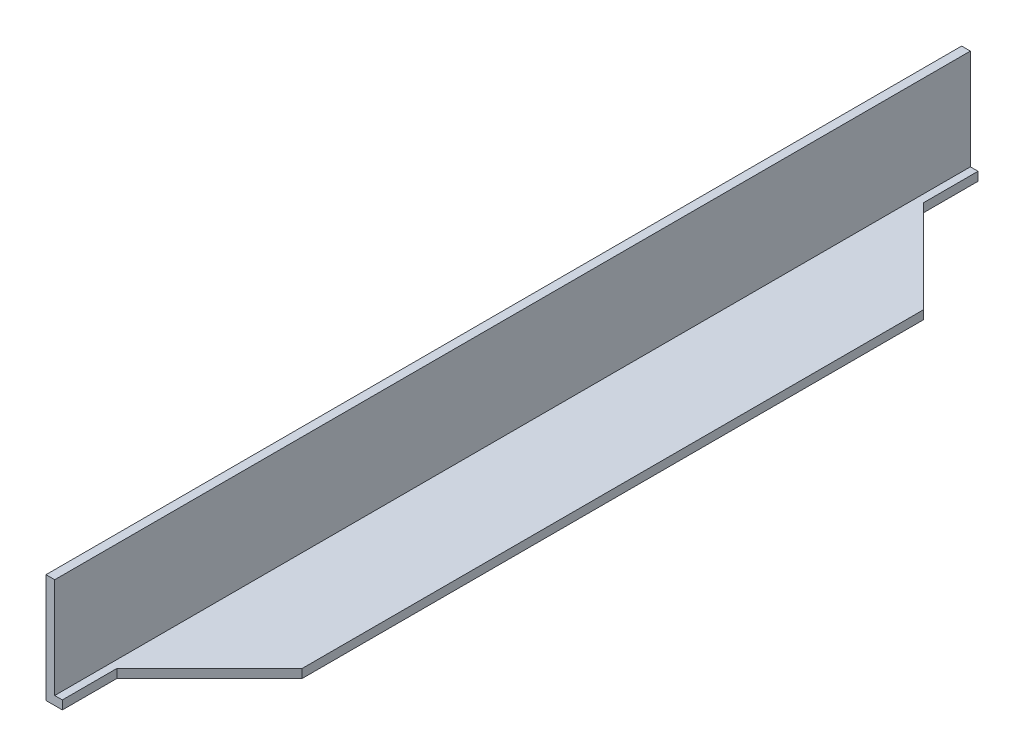
ISO-10303-21;
HEADER;
FILE_DESCRIPTION(('STEP AP214'),'2;1');
FILE_NAME('part.step','',(''),(''),'','','');
FILE_SCHEMA(('AUTOMOTIVE_DESIGN { 1 0 10303 214 1 1 1 1 }'));
ENDSEC;
DATA;
#1=APPLICATION_CONTEXT('core data for automotive mechanical design processes');
#2=APPLICATION_PROTOCOL_DEFINITION('international standard','automotive_design',2000,#1);
#3=PRODUCT_CONTEXT('',#1,'mechanical');
#4=PRODUCT('Part','Part','',(#3));
#5=PRODUCT_RELATED_PRODUCT_CATEGORY('part','',(#4));
#6=PRODUCT_DEFINITION_FORMATION('','',#4);
#7=PRODUCT_DEFINITION_CONTEXT('part definition',#1,'design');
#8=PRODUCT_DEFINITION('design','',#6,#7);
#9=PRODUCT_DEFINITION_SHAPE('','',#8);
#10=(LENGTH_UNIT() NAMED_UNIT(*) SI_UNIT(.MILLI.,.METRE.));
#11=(NAMED_UNIT(*) PLANE_ANGLE_UNIT() SI_UNIT($,.RADIAN.));
#12=(NAMED_UNIT(*) SI_UNIT($,.STERADIAN.) SOLID_ANGLE_UNIT());
#13=UNCERTAINTY_MEASURE_WITH_UNIT(LENGTH_MEASURE(1.E-05),#10,'distance_accuracy_value','');
#14=(GEOMETRIC_REPRESENTATION_CONTEXT(3) GLOBAL_UNCERTAINTY_ASSIGNED_CONTEXT((#13)) GLOBAL_UNIT_ASSIGNED_CONTEXT((#10,
#11,#12)) REPRESENTATION_CONTEXT('',''));
#15=CARTESIAN_POINT('',(0.,0.,0.));
#16=DIRECTION('',(0.,0.,1.));
#17=DIRECTION('',(1.,0.,0.));
#18=AXIS2_PLACEMENT_3D('',#15,#16,#17);
#19=CARTESIAN_POINT('',(0.,0.,840.));
#20=DIRECTION('',(1.,0.,0.));
#21=DIRECTION('',(0.,0.,-1.));
#22=AXIS2_PLACEMENT_3D('',#19,#20,#21);
#23=PLANE('',#22);
#24=DIRECTION('',(0.,-1.,0.));
#25=VECTOR('',#24,1.);
#26=CARTESIAN_POINT('',(0.,0.,0.));
#27=LINE('',#26,#25);
#28=CARTESIAN_POINT('',(0.,100.,0.));
#29=VERTEX_POINT('',#28);
#30=CARTESIAN_POINT('',(0.,0.,0.));
#31=VERTEX_POINT('',#30);
#32=EDGE_CURVE('E142',#29,#31,#27,.T.);
#33=ORIENTED_EDGE('',*,*,#32,.T.);
#34=DIRECTION('',(0.,0.,-1.));
#35=VECTOR('',#34,1.);
#36=CARTESIAN_POINT('',(0.,0.,840.));
#37=LINE('',#36,#35);
#38=CARTESIAN_POINT('',(0.,0.,840.));
#39=VERTEX_POINT('',#38);
#40=EDGE_CURVE('E11',#39,#31,#37,.T.);
#41=ORIENTED_EDGE('',*,*,#40,.F.);
#42=DIRECTION('',(0.,-1.,0.));
#43=VECTOR('',#42,1.);
#44=CARTESIAN_POINT('',(0.,0.,840.));
#45=LINE('',#44,#43);
#46=CARTESIAN_POINT('',(0.,100.,840.));
#47=VERTEX_POINT('',#46);
#48=EDGE_CURVE('E138',#47,#39,#45,.T.);
#49=ORIENTED_EDGE('',*,*,#48,.F.);
#50=DIRECTION('',(0.,0.,-1.));
#51=VECTOR('',#50,1.);
#52=CARTESIAN_POINT('',(0.,100.,840.));
#53=LINE('',#52,#51);
#54=EDGE_CURVE('E131',#47,#29,#53,.T.);
#55=ORIENTED_EDGE('',*,*,#54,.T.);
#56=EDGE_LOOP('',(#33,#41,#49,#55));
#57=FACE_BOUND('',#56,.T.);
#58=ADVANCED_FACE('F32',(#57),#23,.F.);
#59=CARTESIAN_POINT('',(0.,0.,840.));
#60=DIRECTION('',(0.,1.,0.));
#61=DIRECTION('',(0.,0.,1.));
#62=AXIS2_PLACEMENT_3D('',#59,#60,#61);
#63=PLANE('',#62);
#64=DIRECTION('',(-0.707106781186549,0.,0.707106781186546));
#65=VECTOR('',#64,1.);
#66=CARTESIAN_POINT('',(15.,0.,790.));
#67=LINE('',#66,#65);
#68=CARTESIAN_POINT('',(100.,0.,705.));
#69=VERTEX_POINT('',#68);
#70=CARTESIAN_POINT('',(15.,0.,790.));
#71=VERTEX_POINT('',#70);
#72=EDGE_CURVE('E108',#69,#71,#67,.T.);
#73=ORIENTED_EDGE('',*,*,#72,.T.);
#74=DIRECTION('',(0.,0.,1.));
#75=VECTOR('',#74,1.);
#76=CARTESIAN_POINT('',(15.,0.,840.));
#77=LINE('',#76,#75);
#78=CARTESIAN_POINT('',(15.,0.,840.));
#79=VERTEX_POINT('',#78);
#80=EDGE_CURVE('E115',#71,#79,#77,.T.);
#81=ORIENTED_EDGE('',*,*,#80,.T.);
#82=DIRECTION('',(1.,0.,0.));
#83=VECTOR('',#82,1.);
#84=CARTESIAN_POINT('',(0.,0.,840.));
#85=LINE('',#84,#83);
#86=EDGE_CURVE('E146',#39,#79,#85,.T.);
#87=ORIENTED_EDGE('',*,*,#86,.F.);
#88=ORIENTED_EDGE('',*,*,#40,.T.);
#89=DIRECTION('',(1.,0.,0.));
#90=VECTOR('',#89,1.);
#91=CARTESIAN_POINT('',(0.,0.,0.));
#92=LINE('',#91,#90);
#93=CARTESIAN_POINT('',(15.,0.,0.));
#94=VERTEX_POINT('',#93);
#95=EDGE_CURVE('E139',#31,#94,#92,.T.);
#96=ORIENTED_EDGE('',*,*,#95,.T.);
#97=DIRECTION('',(0.,0.,1.));
#98=VECTOR('',#97,1.);
#99=CARTESIAN_POINT('',(15.,0.,0.));
#100=LINE('',#99,#98);
#101=CARTESIAN_POINT('',(15.,0.,50.));
#102=VERTEX_POINT('',#101);
#103=EDGE_CURVE('E175',#94,#102,#100,.T.);
#104=ORIENTED_EDGE('',*,*,#103,.T.);
#105=DIRECTION('',(0.707106781186549,0.,0.707106781186546));
#106=VECTOR('',#105,1.);
#107=CARTESIAN_POINT('',(15.,0.,50.));
#108=LINE('',#107,#106);
#109=CARTESIAN_POINT('',(100.,0.,135.));
#110=VERTEX_POINT('',#109);
#111=EDGE_CURVE('E130',#102,#110,#108,.T.);
#112=ORIENTED_EDGE('',*,*,#111,.T.);
#113=DIRECTION('',(0.,0.,-1.));
#114=VECTOR('',#113,1.);
#115=CARTESIAN_POINT('',(100.,0.,840.));
#116=LINE('',#115,#114);
#117=EDGE_CURVE('E39',#69,#110,#116,.T.);
#118=ORIENTED_EDGE('',*,*,#117,.F.);
#119=EDGE_LOOP('',(#73,#81,#87,#88,#96,#104,#112,#118));
#120=FACE_BOUND('',#119,.T.);
#121=ADVANCED_FACE('F127',(#120),#63,.F.);
#122=CARTESIAN_POINT('',(100.,0.,840.));
#123=DIRECTION('',(-1.,0.,0.));
#124=DIRECTION('',(0.,0.,1.));
#125=AXIS2_PLACEMENT_3D('',#122,#123,#124);
#126=PLANE('',#125);
#127=DIRECTION('',(0.,0.,1.));
#128=VECTOR('',#127,1.);
#129=CARTESIAN_POINT('',(100.,8.00000000000001,0.));
#130=LINE('',#129,#128);
#131=CARTESIAN_POINT('',(100.,8.00000000000001,135.));
#132=VERTEX_POINT('',#131);
#133=CARTESIAN_POINT('',(100.,8.00000000000001,705.));
#134=VERTEX_POINT('',#133);
#135=EDGE_CURVE('E124',#132,#134,#130,.T.);
#136=ORIENTED_EDGE('',*,*,#135,.T.);
#137=DIRECTION('',(0.,1.,0.));
#138=VECTOR('',#137,1.);
#139=CARTESIAN_POINT('',(100.,0.,705.));
#140=LINE('',#139,#138);
#141=EDGE_CURVE('E46',#69,#134,#140,.T.);
#142=ORIENTED_EDGE('',*,*,#141,.F.);
#143=ORIENTED_EDGE('',*,*,#117,.T.);
#144=DIRECTION('',(0.,1.,0.));
#145=VECTOR('',#144,1.);
#146=CARTESIAN_POINT('',(100.,0.,135.));
#147=LINE('',#146,#145);
#148=EDGE_CURVE('E164',#110,#132,#147,.T.);
#149=ORIENTED_EDGE('',*,*,#148,.T.);
#150=EDGE_LOOP('',(#136,#142,#143,#149));
#151=FACE_BOUND('',#150,.T.);
#152=ADVANCED_FACE('F120',(#151),#126,.F.);
#153=CARTESIAN_POINT('',(0.,100.,840.));
#154=DIRECTION('',(0.,-1.,0.));
#155=DIRECTION('',(0.,0.,-1.));
#156=AXIS2_PLACEMENT_3D('',#153,#154,#155);
#157=PLANE('',#156);
#158=DIRECTION('',(-1.,0.,0.));
#159=VECTOR('',#158,1.);
#160=CARTESIAN_POINT('',(0.,100.,840.));
#161=LINE('',#160,#159);
#162=CARTESIAN_POINT('',(8.00000000000001,100.,840.));
#163=VERTEX_POINT('',#162);
#164=EDGE_CURVE('E133',#163,#47,#161,.T.);
#165=ORIENTED_EDGE('',*,*,#164,.F.);
#166=DIRECTION('',(0.,0.,1.));
#167=VECTOR('',#166,1.);
#168=CARTESIAN_POINT('',(8.00000000000001,100.,0.));
#169=LINE('',#168,#167);
#170=CARTESIAN_POINT('',(8.00000000000001,100.,0.));
#171=VERTEX_POINT('',#170);
#172=EDGE_CURVE('E151',#171,#163,#169,.T.);
#173=ORIENTED_EDGE('',*,*,#172,.F.);
#174=DIRECTION('',(-1.,0.,0.));
#175=VECTOR('',#174,1.);
#176=CARTESIAN_POINT('',(0.,100.,0.));
#177=LINE('',#176,#175);
#178=EDGE_CURVE('E136',#171,#29,#177,.T.);
#179=ORIENTED_EDGE('',*,*,#178,.T.);
#180=ORIENTED_EDGE('',*,*,#54,.F.);
#181=EDGE_LOOP('',(#165,#173,#179,#180));
#182=FACE_BOUND('',#181,.T.);
#183=ADVANCED_FACE('F227',(#182),#157,.F.);
#184=CARTESIAN_POINT('',(0.,0.,840.));
#185=DIRECTION('',(0.,0.,-1.));
#186=DIRECTION('',(-1.,0.,0.));
#187=AXIS2_PLACEMENT_3D('',#184,#185,#186);
#188=PLANE('',#187);
#189=ORIENTED_EDGE('',*,*,#86,.T.);
#190=DIRECTION('',(0.,1.,0.));
#191=VECTOR('',#190,1.);
#192=CARTESIAN_POINT('',(15.,0.,840.));
#193=LINE('',#192,#191);
#194=CARTESIAN_POINT('',(15.,7.99999999999999,840.));
#195=VERTEX_POINT('',#194);
#196=EDGE_CURVE('E178',#79,#195,#193,.T.);
#197=ORIENTED_EDGE('',*,*,#196,.T.);
#198=DIRECTION('',(1.,0.,0.));
#199=VECTOR('',#198,1.);
#200=CARTESIAN_POINT('',(100.,8.00000000000001,840.));
#201=LINE('',#200,#199);
#202=CARTESIAN_POINT('',(8.00000000000002,7.99999999999999,840.));
#203=VERTEX_POINT('',#202);
#204=EDGE_CURVE('E157',#203,#195,#201,.T.);
#205=ORIENTED_EDGE('',*,*,#204,.F.);
#206=DIRECTION('',(0.,-1.,0.));
#207=VECTOR('',#206,1.);
#208=CARTESIAN_POINT('',(8.00000000000001,100.,840.));
#209=LINE('',#208,#207);
#210=EDGE_CURVE('E161',#163,#203,#209,.T.);
#211=ORIENTED_EDGE('',*,*,#210,.F.);
#212=ORIENTED_EDGE('',*,*,#164,.T.);
#213=ORIENTED_EDGE('',*,*,#48,.T.);
#214=EDGE_LOOP('',(#189,#197,#205,#211,#212,#213));
#215=FACE_BOUND('',#214,.T.);
#216=ADVANCED_FACE('F189',(#215),#188,.F.);
#217=CARTESIAN_POINT('',(0.,0.,0.));
#218=DIRECTION('',(0.,0.,-1.));
#219=DIRECTION('',(-1.,0.,0.));
#220=AXIS2_PLACEMENT_3D('',#217,#218,#219);
#221=PLANE('',#220);
#222=DIRECTION('',(0.,1.,0.));
#223=VECTOR('',#222,1.);
#224=CARTESIAN_POINT('',(15.,0.,0.));
#225=LINE('',#224,#223);
#226=CARTESIAN_POINT('',(15.,7.99999999999999,0.));
#227=VERTEX_POINT('',#226);
#228=EDGE_CURVE('E54',#94,#227,#225,.T.);
#229=ORIENTED_EDGE('',*,*,#228,.F.);
#230=ORIENTED_EDGE('',*,*,#95,.F.);
#231=ORIENTED_EDGE('',*,*,#32,.F.);
#232=ORIENTED_EDGE('',*,*,#178,.F.);
#233=DIRECTION('',(0.,-1.,0.));
#234=VECTOR('',#233,1.);
#235=CARTESIAN_POINT('',(8.00000000000001,100.,0.));
#236=LINE('',#235,#234);
#237=CARTESIAN_POINT('',(8.00000000000002,7.99999999999999,0.));
#238=VERTEX_POINT('',#237);
#239=EDGE_CURVE('E160',#171,#238,#236,.T.);
#240=ORIENTED_EDGE('',*,*,#239,.T.);
#241=DIRECTION('',(1.,0.,0.));
#242=VECTOR('',#241,1.);
#243=CARTESIAN_POINT('',(100.,8.00000000000001,0.));
#244=LINE('',#243,#242);
#245=EDGE_CURVE('E154',#238,#227,#244,.T.);
#246=ORIENTED_EDGE('',*,*,#245,.T.);
#247=EDGE_LOOP('',(#229,#230,#231,#232,#240,#246));
#248=FACE_BOUND('',#247,.T.);
#249=ADVANCED_FACE('F199',(#248),#221,.T.);
#250=CARTESIAN_POINT('',(100.,8.00000000000001,0.));
#251=DIRECTION('',(0.,-1.,0.));
#252=DIRECTION('',(1.,0.,0.));
#253=AXIS2_PLACEMENT_3D('',#250,#251,#252);
#254=PLANE('',#253);
#255=ORIENTED_EDGE('',*,*,#204,.T.);
#256=DIRECTION('',(0.,0.,1.));
#257=VECTOR('',#256,1.);
#258=CARTESIAN_POINT('',(15.,7.99999999999999,840.));
#259=LINE('',#258,#257);
#260=CARTESIAN_POINT('',(15.,7.99999999999999,790.));
#261=VERTEX_POINT('',#260);
#262=EDGE_CURVE('E116',#261,#195,#259,.T.);
#263=ORIENTED_EDGE('',*,*,#262,.F.);
#264=DIRECTION('',(-0.707106781186549,0.,0.707106781186546));
#265=VECTOR('',#264,1.);
#266=CARTESIAN_POINT('',(15.,7.99999999999999,790.));
#267=LINE('',#266,#265);
#268=EDGE_CURVE('E185',#134,#261,#267,.T.);
#269=ORIENTED_EDGE('',*,*,#268,.F.);
#270=ORIENTED_EDGE('',*,*,#135,.F.);
#271=DIRECTION('',(0.707106781186549,0.,0.707106781186546));
#272=VECTOR('',#271,1.);
#273=CARTESIAN_POINT('',(15.,7.99999999999999,50.));
#274=LINE('',#273,#272);
#275=CARTESIAN_POINT('',(15.,7.99999999999999,50.));
#276=VERTEX_POINT('',#275);
#277=EDGE_CURVE('E173',#276,#132,#274,.T.);
#278=ORIENTED_EDGE('',*,*,#277,.F.);
#279=DIRECTION('',(0.,0.,1.));
#280=VECTOR('',#279,1.);
#281=CARTESIAN_POINT('',(15.,7.99999999999999,0.));
#282=LINE('',#281,#280);
#283=EDGE_CURVE('E176',#227,#276,#282,.T.);
#284=ORIENTED_EDGE('',*,*,#283,.F.);
#285=ORIENTED_EDGE('',*,*,#245,.F.);
#286=DIRECTION('',(0.,0.,1.));
#287=VECTOR('',#286,1.);
#288=CARTESIAN_POINT('',(8.00000000000002,7.99999999999999,0.));
#289=LINE('',#288,#287);
#290=EDGE_CURVE('E153',#238,#203,#289,.T.);
#291=ORIENTED_EDGE('',*,*,#290,.T.);
#292=EDGE_LOOP('',(#255,#263,#269,#270,#278,#284,#285,#291));
#293=FACE_BOUND('',#292,.T.);
#294=ADVANCED_FACE('F203',(#293),#254,.F.);
#295=CARTESIAN_POINT('',(8.00000000000001,100.,0.));
#296=DIRECTION('',(-1.,0.,0.));
#297=DIRECTION('',(0.,-1.,0.));
#298=AXIS2_PLACEMENT_3D('',#295,#296,#297);
#299=PLANE('',#298);
#300=ORIENTED_EDGE('',*,*,#210,.T.);
#301=ORIENTED_EDGE('',*,*,#290,.F.);
#302=ORIENTED_EDGE('',*,*,#239,.F.);
#303=ORIENTED_EDGE('',*,*,#172,.T.);
#304=EDGE_LOOP('',(#300,#301,#302,#303));
#305=FACE_BOUND('',#304,.T.);
#306=ADVANCED_FACE('F206',(#305),#299,.F.);
#307=CARTESIAN_POINT('',(15.,0.,50.));
#308=DIRECTION('',(-0.707106781186546,0.,0.707106781186549));
#309=DIRECTION('',(0.707106781186549,0.,0.707106781186546));
#310=AXIS2_PLACEMENT_3D('',#307,#308,#309);
#311=PLANE('',#310);
#312=ORIENTED_EDGE('',*,*,#277,.T.);
#313=ORIENTED_EDGE('',*,*,#148,.F.);
#314=ORIENTED_EDGE('',*,*,#111,.F.);
#315=DIRECTION('',(0.,1.,0.));
#316=VECTOR('',#315,1.);
#317=CARTESIAN_POINT('',(15.,0.,50.));
#318=LINE('',#317,#316);
#319=EDGE_CURVE('E170',#102,#276,#318,.T.);
#320=ORIENTED_EDGE('',*,*,#319,.T.);
#321=EDGE_LOOP('',(#312,#313,#314,#320));
#322=FACE_BOUND('',#321,.T.);
#323=ADVANCED_FACE('F218',(#322),#311,.F.);
#324=CARTESIAN_POINT('',(15.,0.,0.));
#325=DIRECTION('',(-1.,0.,0.));
#326=DIRECTION('',(0.,-1.,0.));
#327=AXIS2_PLACEMENT_3D('',#324,#325,#326);
#328=PLANE('',#327);
#329=ORIENTED_EDGE('',*,*,#283,.T.);
#330=ORIENTED_EDGE('',*,*,#319,.F.);
#331=ORIENTED_EDGE('',*,*,#103,.F.);
#332=ORIENTED_EDGE('',*,*,#228,.T.);
#333=EDGE_LOOP('',(#329,#330,#331,#332));
#334=FACE_BOUND('',#333,.T.);
#335=ADVANCED_FACE('F211',(#334),#328,.F.);
#336=CARTESIAN_POINT('',(15.,0.,840.));
#337=DIRECTION('',(-1.,0.,0.));
#338=DIRECTION('',(0.,-1.,0.));
#339=AXIS2_PLACEMENT_3D('',#336,#337,#338);
#340=PLANE('',#339);
#341=ORIENTED_EDGE('',*,*,#262,.T.);
#342=ORIENTED_EDGE('',*,*,#196,.F.);
#343=ORIENTED_EDGE('',*,*,#80,.F.);
#344=DIRECTION('',(0.,1.,0.));
#345=VECTOR('',#344,1.);
#346=CARTESIAN_POINT('',(15.,0.,790.));
#347=LINE('',#346,#345);
#348=EDGE_CURVE('E110',#71,#261,#347,.T.);
#349=ORIENTED_EDGE('',*,*,#348,.T.);
#350=EDGE_LOOP('',(#341,#342,#343,#349));
#351=FACE_BOUND('',#350,.T.);
#352=ADVANCED_FACE('F209',(#351),#340,.F.);
#353=CARTESIAN_POINT('',(15.,0.,790.));
#354=DIRECTION('',(-0.707106781186546,0.,-0.707106781186549));
#355=DIRECTION('',(-0.707106781186549,0.,0.707106781186546));
#356=AXIS2_PLACEMENT_3D('',#353,#354,#355);
#357=PLANE('',#356);
#358=ORIENTED_EDGE('',*,*,#268,.T.);
#359=ORIENTED_EDGE('',*,*,#348,.F.);
#360=ORIENTED_EDGE('',*,*,#72,.F.);
#361=ORIENTED_EDGE('',*,*,#141,.T.);
#362=EDGE_LOOP('',(#358,#359,#360,#361));
#363=FACE_BOUND('',#362,.T.);
#364=ADVANCED_FACE('F109',(#363),#357,.F.);
#365=CLOSED_SHELL('',(#58,#121,#152,#183,#216,#249,#294,#306,#323,#335,#352,#364));
#366=MANIFOLD_SOLID_BREP('B2',#365);
#367=ADVANCED_BREP_SHAPE_REPRESENTATION('',(#18,#366),#14);
#368=SHAPE_DEFINITION_REPRESENTATION(#9,#367);
ENDSEC;
END-ISO-10303-21;
